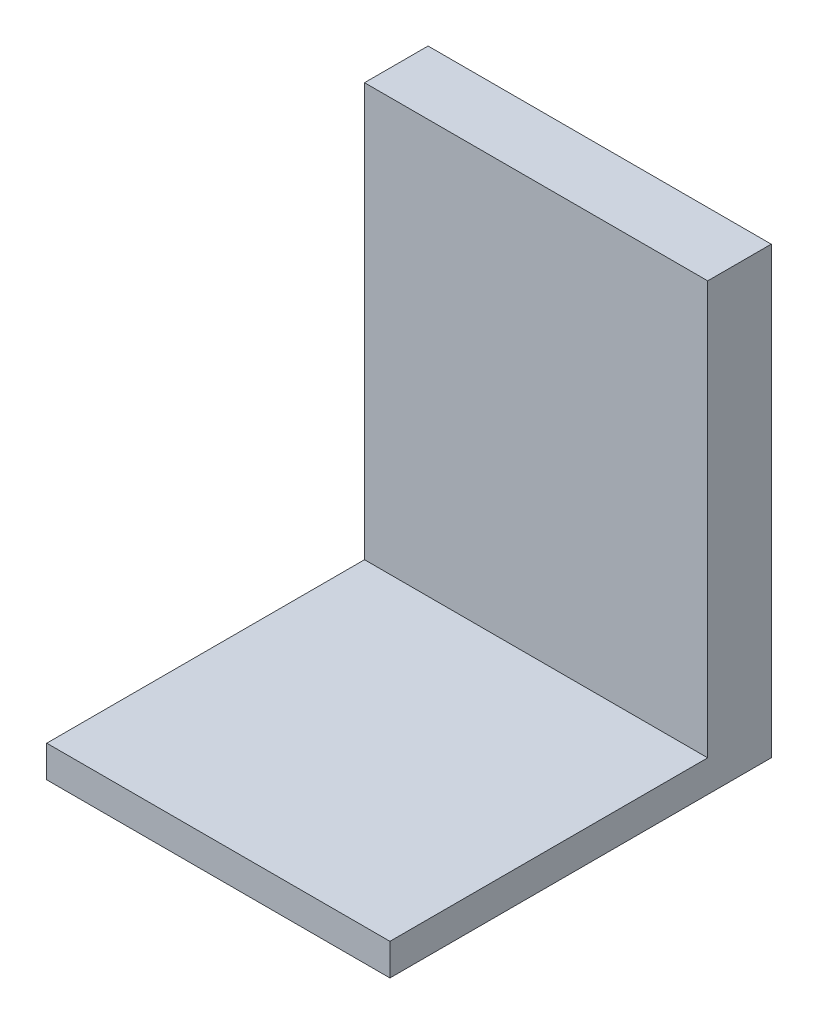
ISO-10303-21;
HEADER;
FILE_DESCRIPTION(('STEP AP214'),'2;1');
FILE_NAME('part.step','',(''),(''),'','','');
FILE_SCHEMA(('AUTOMOTIVE_DESIGN { 1 0 10303 214 1 1 1 1 }'));
ENDSEC;
DATA;
#1=APPLICATION_CONTEXT('core data for automotive mechanical design processes');
#2=APPLICATION_PROTOCOL_DEFINITION('international standard','automotive_design',2000,#1);
#3=PRODUCT_CONTEXT('',#1,'mechanical');
#4=PRODUCT('Part','Part','',(#3));
#5=PRODUCT_RELATED_PRODUCT_CATEGORY('part','',(#4));
#6=PRODUCT_DEFINITION_FORMATION('','',#4);
#7=PRODUCT_DEFINITION_CONTEXT('part definition',#1,'design');
#8=PRODUCT_DEFINITION('design','',#6,#7);
#9=PRODUCT_DEFINITION_SHAPE('','',#8);
#10=(LENGTH_UNIT() NAMED_UNIT(*) SI_UNIT(.MILLI.,.METRE.));
#11=(NAMED_UNIT(*) PLANE_ANGLE_UNIT() SI_UNIT($,.RADIAN.));
#12=(NAMED_UNIT(*) SI_UNIT($,.STERADIAN.) SOLID_ANGLE_UNIT());
#13=UNCERTAINTY_MEASURE_WITH_UNIT(LENGTH_MEASURE(1.E-05),#10,'distance_accuracy_value','');
#14=(GEOMETRIC_REPRESENTATION_CONTEXT(3) GLOBAL_UNCERTAINTY_ASSIGNED_CONTEXT((#13)) GLOBAL_UNIT_ASSIGNED_CONTEXT((#10,
#11,#12)) REPRESENTATION_CONTEXT('',''));
#15=CARTESIAN_POINT('',(0.,0.,0.));
#16=DIRECTION('',(0.,0.,1.));
#17=DIRECTION('',(1.,0.,0.));
#18=AXIS2_PLACEMENT_3D('',#15,#16,#17);
#19=CARTESIAN_POINT('',(0.,530.,0.));
#20=DIRECTION('',(0.,0.,-1.));
#21=DIRECTION('',(-1.,0.,0.));
#22=AXIS2_PLACEMENT_3D('',#19,#20,#21);
#23=PLANE('',#22);
#24=DIRECTION('',(1.,0.,0.));
#25=VECTOR('',#24,1.);
#26=CARTESIAN_POINT('',(9.99999999999982,10.,0.));
#27=LINE('',#26,#25);
#28=CARTESIAN_POINT('',(122.,10.,0.));
#29=VERTEX_POINT('',#28);
#30=CARTESIAN_POINT('',(230.,10.,0.));
#31=VERTEX_POINT('',#30);
#32=EDGE_CURVE('E129',#29,#31,#27,.T.);
#33=ORIENTED_EDGE('',*,*,#32,.F.);
#34=DIRECTION('',(0.,-1.,0.));
#35=VECTOR('',#34,1.);
#36=CARTESIAN_POINT('',(122.,530.,0.));
#37=LINE('',#36,#35);
#38=CARTESIAN_POINT('',(122.,0.,0.));
#39=VERTEX_POINT('',#38);
#40=EDGE_CURVE('E119',#29,#39,#37,.T.);
#41=ORIENTED_EDGE('',*,*,#40,.T.);
#42=DIRECTION('',(1.,0.,0.));
#43=VECTOR('',#42,1.);
#44=CARTESIAN_POINT('',(0.,0.,0.));
#45=LINE('',#44,#43);
#46=CARTESIAN_POINT('',(230.,0.,0.));
#47=VERTEX_POINT('',#46);
#48=EDGE_CURVE('E46',#39,#47,#45,.T.);
#49=ORIENTED_EDGE('',*,*,#48,.T.);
#50=DIRECTION('',(0.,-1.,0.));
#51=VECTOR('',#50,1.);
#52=CARTESIAN_POINT('',(230.,0.,0.));
#53=LINE('',#52,#51);
#54=EDGE_CURVE('E113',#31,#47,#53,.T.);
#55=ORIENTED_EDGE('',*,*,#54,.F.);
#56=EDGE_LOOP('',(#33,#41,#49,#55));
#57=FACE_BOUND('',#56,.T.);
#58=ADVANCED_FACE('F38',(#57),#23,.F.);
#59=CARTESIAN_POINT('',(0.,530.,-120.));
#60=DIRECTION('',(0.,0.,1.));
#61=DIRECTION('',(1.,0.,0.));
#62=AXIS2_PLACEMENT_3D('',#59,#60,#61);
#63=PLANE('',#62);
#64=DIRECTION('',(0.,-1.,0.));
#65=VECTOR('',#64,1.);
#66=CARTESIAN_POINT('',(122.,0.,-120.));
#67=LINE('',#66,#65);
#68=CARTESIAN_POINT('',(122.,140.,-120.));
#69=VERTEX_POINT('',#68);
#70=CARTESIAN_POINT('',(122.,0.,-120.));
#71=VERTEX_POINT('',#70);
#72=EDGE_CURVE('E104',#69,#71,#67,.T.);
#73=ORIENTED_EDGE('',*,*,#72,.F.);
#74=DIRECTION('',(1.,0.,0.));
#75=VECTOR('',#74,1.);
#76=CARTESIAN_POINT('',(122.,140.,-120.));
#77=LINE('',#76,#75);
#78=CARTESIAN_POINT('',(230.,140.,-120.));
#79=VERTEX_POINT('',#78);
#80=EDGE_CURVE('E53',#69,#79,#77,.T.);
#81=ORIENTED_EDGE('',*,*,#80,.T.);
#82=DIRECTION('',(0.,-1.,0.));
#83=VECTOR('',#82,1.);
#84=CARTESIAN_POINT('',(230.,0.,-120.));
#85=LINE('',#84,#83);
#86=CARTESIAN_POINT('',(230.,0.,-120.));
#87=VERTEX_POINT('',#86);
#88=EDGE_CURVE('E102',#79,#87,#85,.T.);
#89=ORIENTED_EDGE('',*,*,#88,.T.);
#90=DIRECTION('',(-1.,0.,0.));
#91=VECTOR('',#90,1.);
#92=CARTESIAN_POINT('',(0.,0.,-120.));
#93=LINE('',#92,#91);
#94=EDGE_CURVE('E11',#87,#71,#93,.T.);
#95=ORIENTED_EDGE('',*,*,#94,.T.);
#96=EDGE_LOOP('',(#73,#81,#89,#95));
#97=FACE_BOUND('',#96,.T.);
#98=ADVANCED_FACE('F101',(#97),#63,.F.);
#99=CARTESIAN_POINT('',(0.,0.,0.));
#100=DIRECTION('',(0.,-1.,0.));
#101=DIRECTION('',(0.,0.,-1.));
#102=AXIS2_PLACEMENT_3D('',#99,#100,#101);
#103=PLANE('',#102);
#104=DIRECTION('',(0.,0.,-1.));
#105=VECTOR('',#104,1.);
#106=CARTESIAN_POINT('',(122.,0.,36.));
#107=LINE('',#106,#105);
#108=EDGE_CURVE('E143',#39,#71,#107,.T.);
#109=ORIENTED_EDGE('',*,*,#108,.T.);
#110=ORIENTED_EDGE('',*,*,#94,.F.);
#111=DIRECTION('',(0.,0.,1.));
#112=VECTOR('',#111,1.);
#113=CARTESIAN_POINT('',(230.,0.,-120.));
#114=LINE('',#113,#112);
#115=EDGE_CURVE('E110',#87,#47,#114,.T.);
#116=ORIENTED_EDGE('',*,*,#115,.T.);
#117=ORIENTED_EDGE('',*,*,#48,.F.);
#118=EDGE_LOOP('',(#109,#110,#116,#117));
#119=FACE_BOUND('',#118,.T.);
#120=ADVANCED_FACE('F142',(#119),#103,.T.);
#121=CARTESIAN_POINT('',(9.99999999999982,10.,-100.));
#122=DIRECTION('',(0.,-1.,0.));
#123=DIRECTION('',(0.,0.,-1.));
#124=AXIS2_PLACEMENT_3D('',#121,#122,#123);
#125=PLANE('',#124);
#126=DIRECTION('',(1.,0.,0.));
#127=VECTOR('',#126,1.);
#128=CARTESIAN_POINT('',(9.99999999999982,10.,-100.));
#129=LINE('',#128,#127);
#130=CARTESIAN_POINT('',(122.,10.,-100.));
#131=VERTEX_POINT('',#130);
#132=CARTESIAN_POINT('',(230.,10.,-100.));
#133=VERTEX_POINT('',#132);
#134=EDGE_CURVE('E61',#131,#133,#129,.T.);
#135=ORIENTED_EDGE('',*,*,#134,.F.);
#136=DIRECTION('',(0.,0.,1.));
#137=VECTOR('',#136,1.);
#138=CARTESIAN_POINT('',(122.,10.,-100.));
#139=LINE('',#138,#137);
#140=EDGE_CURVE('E150',#131,#29,#139,.T.);
#141=ORIENTED_EDGE('',*,*,#140,.T.);
#142=ORIENTED_EDGE('',*,*,#32,.T.);
#143=DIRECTION('',(0.,0.,-1.));
#144=VECTOR('',#143,1.);
#145=CARTESIAN_POINT('',(230.,10.,-100.));
#146=LINE('',#145,#144);
#147=EDGE_CURVE('E125',#31,#133,#146,.T.);
#148=ORIENTED_EDGE('',*,*,#147,.T.);
#149=EDGE_LOOP('',(#135,#141,#142,#148));
#150=FACE_BOUND('',#149,.T.);
#151=ADVANCED_FACE('F160',(#150),#125,.F.);
#152=CARTESIAN_POINT('',(0.,0.,-100.));
#153=DIRECTION('',(0.,0.,-1.));
#154=DIRECTION('',(-1.,0.,0.));
#155=AXIS2_PLACEMENT_3D('',#152,#153,#154);
#156=PLANE('',#155);
#157=DIRECTION('',(0.,1.,0.));
#158=VECTOR('',#157,1.);
#159=CARTESIAN_POINT('',(230.,0.,-100.));
#160=LINE('',#159,#158);
#161=CARTESIAN_POINT('',(230.,140.,-100.));
#162=VERTEX_POINT('',#161);
#163=EDGE_CURVE('E117',#133,#162,#160,.T.);
#164=ORIENTED_EDGE('',*,*,#163,.T.);
#165=DIRECTION('',(-1.,0.,0.));
#166=VECTOR('',#165,1.);
#167=CARTESIAN_POINT('',(0.,140.,-100.));
#168=LINE('',#167,#166);
#169=CARTESIAN_POINT('',(122.,140.,-100.));
#170=VERTEX_POINT('',#169);
#171=EDGE_CURVE('E93',#162,#170,#168,.T.);
#172=ORIENTED_EDGE('',*,*,#171,.T.);
#173=DIRECTION('',(0.,-1.,0.));
#174=VECTOR('',#173,1.);
#175=CARTESIAN_POINT('',(122.,0.,-100.));
#176=LINE('',#175,#174);
#177=EDGE_CURVE('E146',#170,#131,#176,.T.);
#178=ORIENTED_EDGE('',*,*,#177,.T.);
#179=ORIENTED_EDGE('',*,*,#134,.T.);
#180=EDGE_LOOP('',(#164,#172,#178,#179));
#181=FACE_BOUND('',#180,.T.);
#182=ADVANCED_FACE('F163',(#181),#156,.F.);
#183=CARTESIAN_POINT('',(230.,0.,-120.));
#184=DIRECTION('',(-1.,0.,0.));
#185=DIRECTION('',(0.,0.,1.));
#186=AXIS2_PLACEMENT_3D('',#183,#184,#185);
#187=PLANE('',#186);
#188=ORIENTED_EDGE('',*,*,#88,.F.);
#189=DIRECTION('',(0.,0.,1.));
#190=VECTOR('',#189,1.);
#191=CARTESIAN_POINT('',(230.,140.,-120.));
#192=LINE('',#191,#190);
#193=EDGE_CURVE('E90',#79,#162,#192,.T.);
#194=ORIENTED_EDGE('',*,*,#193,.T.);
#195=ORIENTED_EDGE('',*,*,#163,.F.);
#196=ORIENTED_EDGE('',*,*,#147,.F.);
#197=ORIENTED_EDGE('',*,*,#54,.T.);
#198=ORIENTED_EDGE('',*,*,#115,.F.);
#199=EDGE_LOOP('',(#188,#194,#195,#196,#197,#198));
#200=FACE_BOUND('',#199,.T.);
#201=ADVANCED_FACE('F107',(#200),#187,.F.);
#202=CARTESIAN_POINT('',(122.,0.,36.));
#203=DIRECTION('',(1.,0.,0.));
#204=DIRECTION('',(0.,0.,-1.));
#205=AXIS2_PLACEMENT_3D('',#202,#203,#204);
#206=PLANE('',#205);
#207=ORIENTED_EDGE('',*,*,#177,.F.);
#208=DIRECTION('',(0.,0.,1.));
#209=VECTOR('',#208,1.);
#210=CARTESIAN_POINT('',(122.,140.,-120.));
#211=LINE('',#210,#209);
#212=EDGE_CURVE('E97',#69,#170,#211,.T.);
#213=ORIENTED_EDGE('',*,*,#212,.F.);
#214=ORIENTED_EDGE('',*,*,#72,.T.);
#215=ORIENTED_EDGE('',*,*,#108,.F.);
#216=ORIENTED_EDGE('',*,*,#40,.F.);
#217=ORIENTED_EDGE('',*,*,#140,.F.);
#218=EDGE_LOOP('',(#207,#213,#214,#215,#216,#217));
#219=FACE_BOUND('',#218,.T.);
#220=ADVANCED_FACE('F162',(#219),#206,.F.);
#221=CARTESIAN_POINT('',(122.,140.,-120.));
#222=DIRECTION('',(0.,-1.,0.));
#223=DIRECTION('',(0.,0.,-1.));
#224=AXIS2_PLACEMENT_3D('',#221,#222,#223);
#225=PLANE('',#224);
#226=ORIENTED_EDGE('',*,*,#193,.F.);
#227=ORIENTED_EDGE('',*,*,#80,.F.);
#228=ORIENTED_EDGE('',*,*,#212,.T.);
#229=ORIENTED_EDGE('',*,*,#171,.F.);
#230=EDGE_LOOP('',(#226,#227,#228,#229));
#231=FACE_BOUND('',#230,.T.);
#232=ADVANCED_FACE('F91',(#231),#225,.F.);
#233=CLOSED_SHELL('',(#58,#98,#120,#151,#182,#201,#220,#232));
#234=MANIFOLD_SOLID_BREP('B2',#233);
#235=ADVANCED_BREP_SHAPE_REPRESENTATION('',(#18,#234),#14);
#236=SHAPE_DEFINITION_REPRESENTATION(#9,#235);
ENDSEC;
END-ISO-10303-21;
